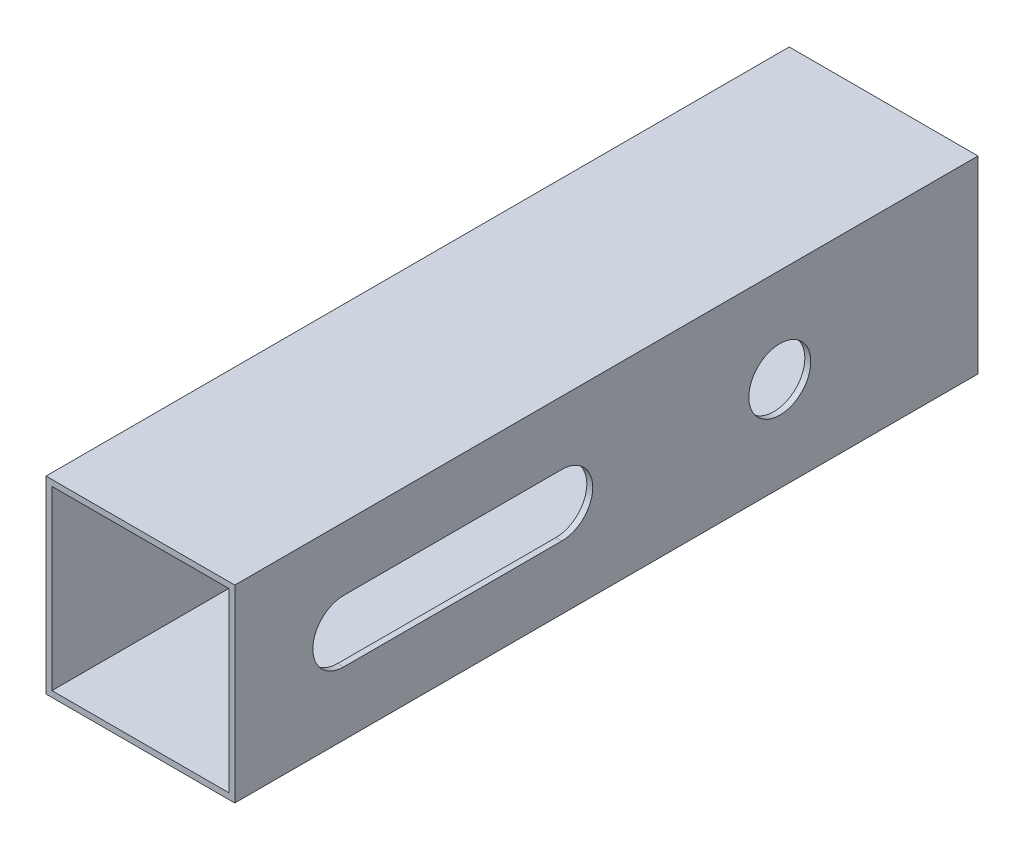
ISO-10303-21;
HEADER;
FILE_DESCRIPTION(('STEP AP214'),'2;1');
FILE_NAME('part.step','',(''),(''),'','','');
FILE_SCHEMA(('AUTOMOTIVE_DESIGN { 1 0 10303 214 1 1 1 1 }'));
ENDSEC;
DATA;
#1=APPLICATION_CONTEXT('core data for automotive mechanical design processes');
#2=APPLICATION_PROTOCOL_DEFINITION('international standard','automotive_design',2000,#1);
#3=PRODUCT_CONTEXT('',#1,'mechanical');
#4=PRODUCT('Part','Part','',(#3));
#5=PRODUCT_RELATED_PRODUCT_CATEGORY('part','',(#4));
#6=PRODUCT_DEFINITION_FORMATION('','',#4);
#7=PRODUCT_DEFINITION_CONTEXT('part definition',#1,'design');
#8=PRODUCT_DEFINITION('design','',#6,#7);
#9=PRODUCT_DEFINITION_SHAPE('','',#8);
#10=(LENGTH_UNIT() NAMED_UNIT(*) SI_UNIT(.MILLI.,.METRE.));
#11=(NAMED_UNIT(*) PLANE_ANGLE_UNIT() SI_UNIT($,.RADIAN.));
#12=(NAMED_UNIT(*) SI_UNIT($,.STERADIAN.) SOLID_ANGLE_UNIT());
#13=UNCERTAINTY_MEASURE_WITH_UNIT(LENGTH_MEASURE(1.E-05),#10,'distance_accuracy_value','');
#14=(GEOMETRIC_REPRESENTATION_CONTEXT(3) GLOBAL_UNCERTAINTY_ASSIGNED_CONTEXT((#13)) GLOBAL_UNIT_ASSIGNED_CONTEXT((#10,
#11,#12)) REPRESENTATION_CONTEXT('',''));
#15=CARTESIAN_POINT('',(0.,0.,0.));
#16=DIRECTION('',(0.,0.,1.));
#17=DIRECTION('',(1.,0.,0.));
#18=AXIS2_PLACEMENT_3D('',#15,#16,#17);
#19=CARTESIAN_POINT('',(19.05,19.05,150.));
#20=DIRECTION('',(-1.,0.,0.));
#21=DIRECTION('',(0.,-1.,0.));
#22=AXIS2_PLACEMENT_3D('',#19,#20,#21);
#23=PLANE('',#22);
#24=DIRECTION('',(0.,0.,-1.));
#25=VECTOR('',#24,1.);
#26=CARTESIAN_POINT('',(19.05,-6.25,128.));
#27=LINE('',#26,#25);
#28=CARTESIAN_POINT('',(19.05,-6.25,128.));
#29=VERTEX_POINT('',#28);
#30=CARTESIAN_POINT('',(19.05,-6.25,84.));
#31=VERTEX_POINT('',#30);
#32=EDGE_CURVE('E147',#29,#31,#27,.T.);
#33=ORIENTED_EDGE('',*,*,#32,.F.);
#34=CARTESIAN_POINT('',(19.05,0.,128.));
#35=DIRECTION('',(1.,0.,0.));
#36=DIRECTION('',(0.,1.,0.));
#37=AXIS2_PLACEMENT_3D('',#34,#35,#36);
#38=CIRCLE('',#37,6.25);
#39=CARTESIAN_POINT('',(19.05,6.25000000000001,128.));
#40=VERTEX_POINT('',#39);
#41=EDGE_CURVE('E60',#40,#29,#38,.T.);
#42=ORIENTED_EDGE('',*,*,#41,.F.);
#43=DIRECTION('',(0.,0.,1.));
#44=VECTOR('',#43,1.);
#45=CARTESIAN_POINT('',(19.05,6.25000000000001,128.));
#46=LINE('',#45,#44);
#47=CARTESIAN_POINT('',(19.05,6.25000000000001,84.));
#48=VERTEX_POINT('',#47);
#49=EDGE_CURVE('E154',#48,#40,#46,.T.);
#50=ORIENTED_EDGE('',*,*,#49,.F.);
#51=CARTESIAN_POINT('',(19.05,0.,84.));
#52=DIRECTION('',(1.,0.,0.));
#53=DIRECTION('',(0.,1.,0.));
#54=AXIS2_PLACEMENT_3D('',#51,#52,#53);
#55=CIRCLE('',#54,6.25);
#56=EDGE_CURVE('E137',#31,#48,#55,.T.);
#57=ORIENTED_EDGE('',*,*,#56,.F.);
#58=EDGE_LOOP('',(#33,#42,#50,#57));
#59=FACE_BOUND('',#58,.T.);
#60=CARTESIAN_POINT('',(19.05,0.,40.));
#61=DIRECTION('',(1.,0.,0.));
#62=DIRECTION('',(0.,1.,0.));
#63=AXIS2_PLACEMENT_3D('',#60,#61,#62);
#64=CIRCLE('',#63,6.25);
#65=CARTESIAN_POINT('',(19.05,6.25,40.));
#66=VERTEX_POINT('',#65);
#67=EDGE_CURVE('E169',#66,#66,#64,.T.);
#68=ORIENTED_EDGE('',*,*,#67,.F.);
#69=EDGE_LOOP('',(#68));
#70=FACE_BOUND('',#69,.T.);
#71=DIRECTION('',(0.,1.,0.));
#72=VECTOR('',#71,1.);
#73=CARTESIAN_POINT('',(19.05,19.05,0.));
#74=LINE('',#73,#72);
#75=CARTESIAN_POINT('',(19.05,-19.05,0.));
#76=VERTEX_POINT('',#75);
#77=CARTESIAN_POINT('',(19.05,19.05,0.));
#78=VERTEX_POINT('',#77);
#79=EDGE_CURVE('E214',#76,#78,#74,.T.);
#80=ORIENTED_EDGE('',*,*,#79,.T.);
#81=DIRECTION('',(0.,0.,-1.));
#82=VECTOR('',#81,1.);
#83=CARTESIAN_POINT('',(19.05,19.05,150.));
#84=LINE('',#83,#82);
#85=CARTESIAN_POINT('',(19.05,19.05,150.));
#86=VERTEX_POINT('',#85);
#87=EDGE_CURVE('E252',#86,#78,#84,.T.);
#88=ORIENTED_EDGE('',*,*,#87,.F.);
#89=DIRECTION('',(0.,1.,0.));
#90=VECTOR('',#89,1.);
#91=CARTESIAN_POINT('',(19.05,19.05,150.));
#92=LINE('',#91,#90);
#93=CARTESIAN_POINT('',(19.05,-19.05,150.));
#94=VERTEX_POINT('',#93);
#95=EDGE_CURVE('E215',#94,#86,#92,.T.);
#96=ORIENTED_EDGE('',*,*,#95,.F.);
#97=DIRECTION('',(0.,0.,-1.));
#98=VECTOR('',#97,1.);
#99=CARTESIAN_POINT('',(19.05,-19.05,150.));
#100=LINE('',#99,#98);
#101=EDGE_CURVE('E229',#94,#76,#100,.T.);
#102=ORIENTED_EDGE('',*,*,#101,.T.);
#103=EDGE_LOOP('',(#80,#88,#96,#102));
#104=FACE_BOUND('',#103,.T.);
#105=ADVANCED_FACE('F45',(#59,#70,#104),#23,.F.);
#106=CARTESIAN_POINT('',(-19.05,19.05,150.));
#107=DIRECTION('',(0.,-1.,0.));
#108=DIRECTION('',(0.,0.,-1.));
#109=AXIS2_PLACEMENT_3D('',#106,#107,#108);
#110=PLANE('',#109);
#111=DIRECTION('',(-1.,0.,0.));
#112=VECTOR('',#111,1.);
#113=CARTESIAN_POINT('',(-19.05,19.05,0.));
#114=LINE('',#113,#112);
#115=CARTESIAN_POINT('',(-19.05,19.05,0.));
#116=VERTEX_POINT('',#115);
#117=EDGE_CURVE('E233',#78,#116,#114,.T.);
#118=ORIENTED_EDGE('',*,*,#117,.T.);
#119=DIRECTION('',(0.,0.,-1.));
#120=VECTOR('',#119,1.);
#121=CARTESIAN_POINT('',(-19.05,19.05,150.));
#122=LINE('',#121,#120);
#123=CARTESIAN_POINT('',(-19.05,19.05,150.));
#124=VERTEX_POINT('',#123);
#125=EDGE_CURVE('E248',#124,#116,#122,.T.);
#126=ORIENTED_EDGE('',*,*,#125,.F.);
#127=DIRECTION('',(-1.,0.,0.));
#128=VECTOR('',#127,1.);
#129=CARTESIAN_POINT('',(-19.05,19.05,150.));
#130=LINE('',#129,#128);
#131=EDGE_CURVE('E219',#86,#124,#130,.T.);
#132=ORIENTED_EDGE('',*,*,#131,.F.);
#133=ORIENTED_EDGE('',*,*,#87,.T.);
#134=EDGE_LOOP('',(#118,#126,#132,#133));
#135=FACE_BOUND('',#134,.T.);
#136=ADVANCED_FACE('F285',(#135),#110,.F.);
#137=CARTESIAN_POINT('',(-19.05,19.05,150.));
#138=DIRECTION('',(1.,0.,0.));
#139=DIRECTION('',(0.,1.,0.));
#140=AXIS2_PLACEMENT_3D('',#137,#138,#139);
#141=PLANE('',#140);
#142=DIRECTION('',(0.,-1.,0.));
#143=VECTOR('',#142,1.);
#144=CARTESIAN_POINT('',(-19.05,19.05,0.));
#145=LINE('',#144,#143);
#146=CARTESIAN_POINT('',(-19.05,-19.05,0.));
#147=VERTEX_POINT('',#146);
#148=EDGE_CURVE('E236',#116,#147,#145,.T.);
#149=ORIENTED_EDGE('',*,*,#148,.T.);
#150=DIRECTION('',(0.,0.,-1.));
#151=VECTOR('',#150,1.);
#152=CARTESIAN_POINT('',(-19.05,-19.05,150.));
#153=LINE('',#152,#151);
#154=CARTESIAN_POINT('',(-19.05,-19.05,150.));
#155=VERTEX_POINT('',#154);
#156=EDGE_CURVE('E244',#155,#147,#153,.T.);
#157=ORIENTED_EDGE('',*,*,#156,.F.);
#158=DIRECTION('',(0.,-1.,0.));
#159=VECTOR('',#158,1.);
#160=CARTESIAN_POINT('',(-19.05,19.05,150.));
#161=LINE('',#160,#159);
#162=EDGE_CURVE('E223',#124,#155,#161,.T.);
#163=ORIENTED_EDGE('',*,*,#162,.F.);
#164=ORIENTED_EDGE('',*,*,#125,.T.);
#165=EDGE_LOOP('',(#149,#157,#163,#164));
#166=FACE_BOUND('',#165,.T.);
#167=ADVANCED_FACE('F291',(#166),#141,.F.);
#168=CARTESIAN_POINT('',(-19.05,-19.05,150.));
#169=DIRECTION('',(0.,1.,0.));
#170=DIRECTION('',(0.,0.,1.));
#171=AXIS2_PLACEMENT_3D('',#168,#169,#170);
#172=PLANE('',#171);
#173=DIRECTION('',(1.,0.,0.));
#174=VECTOR('',#173,1.);
#175=CARTESIAN_POINT('',(-19.05,-19.05,0.));
#176=LINE('',#175,#174);
#177=EDGE_CURVE('E220',#147,#76,#176,.T.);
#178=ORIENTED_EDGE('',*,*,#177,.T.);
#179=ORIENTED_EDGE('',*,*,#101,.F.);
#180=DIRECTION('',(1.,0.,0.));
#181=VECTOR('',#180,1.);
#182=CARTESIAN_POINT('',(-19.05,-19.05,150.));
#183=LINE('',#182,#181);
#184=EDGE_CURVE('E226',#155,#94,#183,.T.);
#185=ORIENTED_EDGE('',*,*,#184,.F.);
#186=ORIENTED_EDGE('',*,*,#156,.T.);
#187=EDGE_LOOP('',(#178,#179,#185,#186));
#188=FACE_BOUND('',#187,.T.);
#189=ADVANCED_FACE('F296',(#188),#172,.F.);
#190=CARTESIAN_POINT('',(0.,0.,150.));
#191=DIRECTION('',(0.,0.,1.));
#192=DIRECTION('',(1.,0.,0.));
#193=AXIS2_PLACEMENT_3D('',#190,#191,#192);
#194=PLANE('',#193);
#195=DIRECTION('',(0.,-1.,0.));
#196=VECTOR('',#195,1.);
#197=CARTESIAN_POINT('',(-17.85,0.,150.));
#198=LINE('',#197,#196);
#199=CARTESIAN_POINT('',(-17.85,17.85,150.));
#200=VERTEX_POINT('',#199);
#201=CARTESIAN_POINT('',(-17.85,-17.85,150.));
#202=VERTEX_POINT('',#201);
#203=EDGE_CURVE('E211',#200,#202,#198,.T.);
#204=ORIENTED_EDGE('',*,*,#203,.F.);
#205=DIRECTION('',(-1.,0.,0.));
#206=VECTOR('',#205,1.);
#207=CARTESIAN_POINT('',(0.,17.85,150.));
#208=LINE('',#207,#206);
#209=CARTESIAN_POINT('',(17.85,17.85,150.));
#210=VERTEX_POINT('',#209);
#211=EDGE_CURVE('E192',#210,#200,#208,.T.);
#212=ORIENTED_EDGE('',*,*,#211,.F.);
#213=DIRECTION('',(0.,1.,0.));
#214=VECTOR('',#213,1.);
#215=CARTESIAN_POINT('',(17.85,0.,150.));
#216=LINE('',#215,#214);
#217=CARTESIAN_POINT('',(17.85,-17.85,150.));
#218=VERTEX_POINT('',#217);
#219=EDGE_CURVE('E204',#218,#210,#216,.T.);
#220=ORIENTED_EDGE('',*,*,#219,.F.);
#221=DIRECTION('',(1.,0.,0.));
#222=VECTOR('',#221,1.);
#223=CARTESIAN_POINT('',(0.,-17.85,150.));
#224=LINE('',#223,#222);
#225=EDGE_CURVE('E208',#202,#218,#224,.T.);
#226=ORIENTED_EDGE('',*,*,#225,.F.);
#227=EDGE_LOOP('',(#204,#212,#220,#226));
#228=FACE_BOUND('',#227,.T.);
#229=ORIENTED_EDGE('',*,*,#95,.T.);
#230=ORIENTED_EDGE('',*,*,#131,.T.);
#231=ORIENTED_EDGE('',*,*,#162,.T.);
#232=ORIENTED_EDGE('',*,*,#184,.T.);
#233=EDGE_LOOP('',(#229,#230,#231,#232));
#234=FACE_BOUND('',#233,.T.);
#235=ADVANCED_FACE('F302',(#228,#234),#194,.T.);
#236=CARTESIAN_POINT('',(0.,0.,0.));
#237=DIRECTION('',(0.,0.,1.));
#238=DIRECTION('',(1.,0.,0.));
#239=AXIS2_PLACEMENT_3D('',#236,#237,#238);
#240=PLANE('',#239);
#241=DIRECTION('',(1.,0.,0.));
#242=VECTOR('',#241,1.);
#243=CARTESIAN_POINT('',(17.85,17.85,0.));
#244=LINE('',#243,#242);
#245=CARTESIAN_POINT('',(-17.85,17.85,0.));
#246=VERTEX_POINT('',#245);
#247=CARTESIAN_POINT('',(17.85,17.85,0.));
#248=VERTEX_POINT('',#247);
#249=EDGE_CURVE('E176',#246,#248,#244,.T.);
#250=ORIENTED_EDGE('',*,*,#249,.F.);
#251=DIRECTION('',(0.,1.,0.));
#252=VECTOR('',#251,1.);
#253=CARTESIAN_POINT('',(-17.85,17.85,0.));
#254=LINE('',#253,#252);
#255=CARTESIAN_POINT('',(-17.85,-17.85,0.));
#256=VERTEX_POINT('',#255);
#257=EDGE_CURVE('E173',#256,#246,#254,.T.);
#258=ORIENTED_EDGE('',*,*,#257,.F.);
#259=DIRECTION('',(-1.,0.,0.));
#260=VECTOR('',#259,1.);
#261=CARTESIAN_POINT('',(17.85,-17.85,0.));
#262=LINE('',#261,#260);
#263=CARTESIAN_POINT('',(17.85,-17.85,0.));
#264=VERTEX_POINT('',#263);
#265=EDGE_CURVE('E184',#264,#256,#262,.T.);
#266=ORIENTED_EDGE('',*,*,#265,.F.);
#267=DIRECTION('',(0.,-1.,0.));
#268=VECTOR('',#267,1.);
#269=CARTESIAN_POINT('',(17.85,17.85,0.));
#270=LINE('',#269,#268);
#271=EDGE_CURVE('E180',#248,#264,#270,.T.);
#272=ORIENTED_EDGE('',*,*,#271,.F.);
#273=EDGE_LOOP('',(#250,#258,#266,#272));
#274=FACE_BOUND('',#273,.T.);
#275=ORIENTED_EDGE('',*,*,#79,.F.);
#276=ORIENTED_EDGE('',*,*,#177,.F.);
#277=ORIENTED_EDGE('',*,*,#148,.F.);
#278=ORIENTED_EDGE('',*,*,#117,.F.);
#279=EDGE_LOOP('',(#275,#276,#277,#278));
#280=FACE_BOUND('',#279,.T.);
#281=ADVANCED_FACE('F304',(#274,#280),#240,.F.);
#282=CARTESIAN_POINT('',(-17.85,17.85,300.));
#283=DIRECTION('',(-1.,0.,0.));
#284=DIRECTION('',(0.,0.,1.));
#285=AXIS2_PLACEMENT_3D('',#282,#283,#284);
#286=PLANE('',#285);
#287=ORIENTED_EDGE('',*,*,#203,.T.);
#288=DIRECTION('',(0.,0.,-1.));
#289=VECTOR('',#288,1.);
#290=CARTESIAN_POINT('',(-17.85,-17.85,300.));
#291=LINE('',#290,#289);
#292=EDGE_CURVE('E189',#202,#256,#291,.T.);
#293=ORIENTED_EDGE('',*,*,#292,.T.);
#294=ORIENTED_EDGE('',*,*,#257,.T.);
#295=DIRECTION('',(0.,0.,-1.));
#296=VECTOR('',#295,1.);
#297=CARTESIAN_POINT('',(-17.85,17.85,300.));
#298=LINE('',#297,#296);
#299=EDGE_CURVE('E188',#200,#246,#298,.T.);
#300=ORIENTED_EDGE('',*,*,#299,.F.);
#301=EDGE_LOOP('',(#287,#293,#294,#300));
#302=FACE_BOUND('',#301,.T.);
#303=ADVANCED_FACE('F307',(#302),#286,.F.);
#304=CARTESIAN_POINT('',(17.85,-17.85,300.));
#305=DIRECTION('',(0.,-1.,0.));
#306=DIRECTION('',(0.,0.,-1.));
#307=AXIS2_PLACEMENT_3D('',#304,#305,#306);
#308=PLANE('',#307);
#309=ORIENTED_EDGE('',*,*,#225,.T.);
#310=DIRECTION('',(0.,0.,-1.));
#311=VECTOR('',#310,1.);
#312=CARTESIAN_POINT('',(17.85,-17.85,300.));
#313=LINE('',#312,#311);
#314=EDGE_CURVE('E193',#218,#264,#313,.T.);
#315=ORIENTED_EDGE('',*,*,#314,.T.);
#316=ORIENTED_EDGE('',*,*,#265,.T.);
#317=ORIENTED_EDGE('',*,*,#292,.F.);
#318=EDGE_LOOP('',(#309,#315,#316,#317));
#319=FACE_BOUND('',#318,.T.);
#320=ADVANCED_FACE('F314',(#319),#308,.F.);
#321=CARTESIAN_POINT('',(17.85,17.85,300.));
#322=DIRECTION('',(1.,0.,0.));
#323=DIRECTION('',(0.,0.,-1.));
#324=AXIS2_PLACEMENT_3D('',#321,#322,#323);
#325=PLANE('',#324);
#326=DIRECTION('',(0.,0.,1.));
#327=VECTOR('',#326,1.);
#328=CARTESIAN_POINT('',(17.85,6.25000000000001,300.));
#329=LINE('',#328,#327);
#330=CARTESIAN_POINT('',(17.85,6.25000000000001,84.));
#331=VERTEX_POINT('',#330);
#332=CARTESIAN_POINT('',(17.85,6.25000000000001,128.));
#333=VERTEX_POINT('',#332);
#334=EDGE_CURVE('E53',#331,#333,#329,.T.);
#335=ORIENTED_EDGE('',*,*,#334,.T.);
#336=CARTESIAN_POINT('',(17.85,0.,128.));
#337=DIRECTION('',(1.,0.,0.));
#338=DIRECTION('',(0.,0.,-1.));
#339=AXIS2_PLACEMENT_3D('',#336,#337,#338);
#340=CIRCLE('',#339,6.25);
#341=CARTESIAN_POINT('',(17.85,-6.25,128.));
#342=VERTEX_POINT('',#341);
#343=EDGE_CURVE('E11',#333,#342,#340,.T.);
#344=ORIENTED_EDGE('',*,*,#343,.T.);
#345=DIRECTION('',(0.,0.,-1.));
#346=VECTOR('',#345,1.);
#347=CARTESIAN_POINT('',(17.85,-6.25,300.));
#348=LINE('',#347,#346);
#349=CARTESIAN_POINT('',(17.85,-6.25,84.));
#350=VERTEX_POINT('',#349);
#351=EDGE_CURVE('E256',#342,#350,#348,.T.);
#352=ORIENTED_EDGE('',*,*,#351,.T.);
#353=CARTESIAN_POINT('',(17.85,0.,84.));
#354=DIRECTION('',(1.,0.,0.));
#355=DIRECTION('',(0.,0.,-1.));
#356=AXIS2_PLACEMENT_3D('',#353,#354,#355);
#357=CIRCLE('',#356,6.25);
#358=EDGE_CURVE('E140',#350,#331,#357,.T.);
#359=ORIENTED_EDGE('',*,*,#358,.T.);
#360=EDGE_LOOP('',(#335,#344,#352,#359));
#361=FACE_BOUND('',#360,.T.);
#362=CARTESIAN_POINT('',(17.85,0.,40.));
#363=DIRECTION('',(1.,0.,0.));
#364=DIRECTION('',(0.,0.,-1.));
#365=AXIS2_PLACEMENT_3D('',#362,#363,#364);
#366=CIRCLE('',#365,6.25);
#367=CARTESIAN_POINT('',(17.85,0.,33.75));
#368=VERTEX_POINT('',#367);
#369=EDGE_CURVE('E164',#368,#368,#366,.T.);
#370=ORIENTED_EDGE('',*,*,#369,.T.);
#371=EDGE_LOOP('',(#370));
#372=FACE_BOUND('',#371,.T.);
#373=ORIENTED_EDGE('',*,*,#219,.T.);
#374=DIRECTION('',(0.,0.,-1.));
#375=VECTOR('',#374,1.);
#376=CARTESIAN_POINT('',(17.85,17.85,300.));
#377=LINE('',#376,#375);
#378=EDGE_CURVE('E196',#210,#248,#377,.T.);
#379=ORIENTED_EDGE('',*,*,#378,.T.);
#380=ORIENTED_EDGE('',*,*,#271,.T.);
#381=ORIENTED_EDGE('',*,*,#314,.F.);
#382=EDGE_LOOP('',(#373,#379,#380,#381));
#383=FACE_BOUND('',#382,.T.);
#384=ADVANCED_FACE('F266',(#361,#372,#383),#325,.F.);
#385=CARTESIAN_POINT('',(17.85,17.85,300.));
#386=DIRECTION('',(0.,1.,0.));
#387=DIRECTION('',(0.,0.,1.));
#388=AXIS2_PLACEMENT_3D('',#385,#386,#387);
#389=PLANE('',#388);
#390=ORIENTED_EDGE('',*,*,#211,.T.);
#391=ORIENTED_EDGE('',*,*,#299,.T.);
#392=ORIENTED_EDGE('',*,*,#249,.T.);
#393=ORIENTED_EDGE('',*,*,#378,.F.);
#394=EDGE_LOOP('',(#390,#391,#392,#393));
#395=FACE_BOUND('',#394,.T.);
#396=ADVANCED_FACE('F280',(#395),#389,.F.);
#397=CARTESIAN_POINT('',(9.05,0.,40.));
#398=DIRECTION('',(1.,0.,0.));
#399=DIRECTION('',(0.,1.,0.));
#400=AXIS2_PLACEMENT_3D('',#397,#398,#399);
#401=CYLINDRICAL_SURFACE('',#400,6.25);
#402=ORIENTED_EDGE('',*,*,#67,.T.);
#403=EDGE_LOOP('',(#402));
#404=FACE_BOUND('',#403,.T.);
#405=ORIENTED_EDGE('',*,*,#369,.F.);
#406=EDGE_LOOP('',(#405));
#407=FACE_BOUND('',#406,.T.);
#408=ADVANCED_FACE('F273',(#404,#407),#401,.F.);
#409=CARTESIAN_POINT('',(9.05,0.,128.));
#410=DIRECTION('',(1.,0.,0.));
#411=DIRECTION('',(0.,1.,0.));
#412=AXIS2_PLACEMENT_3D('',#409,#410,#411);
#413=CYLINDRICAL_SURFACE('',#412,6.25);
#414=DIRECTION('',(1.,0.,0.));
#415=VECTOR('',#414,1.);
#416=CARTESIAN_POINT('',(9.05,6.25,128.));
#417=LINE('',#416,#415);
#418=EDGE_CURVE('E161',#333,#40,#417,.T.);
#419=ORIENTED_EDGE('',*,*,#418,.T.);
#420=ORIENTED_EDGE('',*,*,#41,.T.);
#421=DIRECTION('',(1.,0.,0.));
#422=VECTOR('',#421,1.);
#423=CARTESIAN_POINT('',(9.05,-6.25,128.));
#424=LINE('',#423,#422);
#425=EDGE_CURVE('E144',#342,#29,#424,.T.);
#426=ORIENTED_EDGE('',*,*,#425,.F.);
#427=ORIENTED_EDGE('',*,*,#343,.F.);
#428=EDGE_LOOP('',(#419,#420,#426,#427));
#429=FACE_BOUND('',#428,.T.);
#430=ADVANCED_FACE('F271',(#429),#413,.F.);
#431=CARTESIAN_POINT('',(9.05,6.25,128.));
#432=DIRECTION('',(0.,1.,0.));
#433=DIRECTION('',(-1.,0.,0.));
#434=AXIS2_PLACEMENT_3D('',#431,#432,#433);
#435=PLANE('',#434);
#436=DIRECTION('',(1.,0.,0.));
#437=VECTOR('',#436,1.);
#438=CARTESIAN_POINT('',(9.05,6.25,84.));
#439=LINE('',#438,#437);
#440=EDGE_CURVE('E143',#331,#48,#439,.T.);
#441=ORIENTED_EDGE('',*,*,#440,.T.);
#442=ORIENTED_EDGE('',*,*,#49,.T.);
#443=ORIENTED_EDGE('',*,*,#418,.F.);
#444=ORIENTED_EDGE('',*,*,#334,.F.);
#445=EDGE_LOOP('',(#441,#442,#443,#444));
#446=FACE_BOUND('',#445,.T.);
#447=ADVANCED_FACE('F270',(#446),#435,.F.);
#448=CARTESIAN_POINT('',(9.05,0.,84.));
#449=DIRECTION('',(1.,0.,0.));
#450=DIRECTION('',(0.,1.,0.));
#451=AXIS2_PLACEMENT_3D('',#448,#449,#450);
#452=CYLINDRICAL_SURFACE('',#451,6.25);
#453=DIRECTION('',(1.,0.,0.));
#454=VECTOR('',#453,1.);
#455=CARTESIAN_POINT('',(9.05,-6.25,84.));
#456=LINE('',#455,#454);
#457=EDGE_CURVE('E68',#350,#31,#456,.T.);
#458=ORIENTED_EDGE('',*,*,#457,.T.);
#459=ORIENTED_EDGE('',*,*,#56,.T.);
#460=ORIENTED_EDGE('',*,*,#440,.F.);
#461=ORIENTED_EDGE('',*,*,#358,.F.);
#462=EDGE_LOOP('',(#458,#459,#460,#461));
#463=FACE_BOUND('',#462,.T.);
#464=ADVANCED_FACE('F134',(#463),#452,.F.);
#465=CARTESIAN_POINT('',(9.05,-6.25,128.));
#466=DIRECTION('',(0.,-1.,0.));
#467=DIRECTION('',(1.,0.,0.));
#468=AXIS2_PLACEMENT_3D('',#465,#466,#467);
#469=PLANE('',#468);
#470=ORIENTED_EDGE('',*,*,#425,.T.);
#471=ORIENTED_EDGE('',*,*,#32,.T.);
#472=ORIENTED_EDGE('',*,*,#457,.F.);
#473=ORIENTED_EDGE('',*,*,#351,.F.);
#474=EDGE_LOOP('',(#470,#471,#472,#473));
#475=FACE_BOUND('',#474,.T.);
#476=ADVANCED_FACE('F148',(#475),#469,.F.);
#477=CLOSED_SHELL('',(#105,#136,#167,#189,#235,#281,#303,#320,#384,#396,#408,#430,#447,#464,#476));
#478=MANIFOLD_SOLID_BREP('B2',#477);
#479=ADVANCED_BREP_SHAPE_REPRESENTATION('',(#18,#478),#14);
#480=SHAPE_DEFINITION_REPRESENTATION(#9,#479);
ENDSEC;
END-ISO-10303-21;
